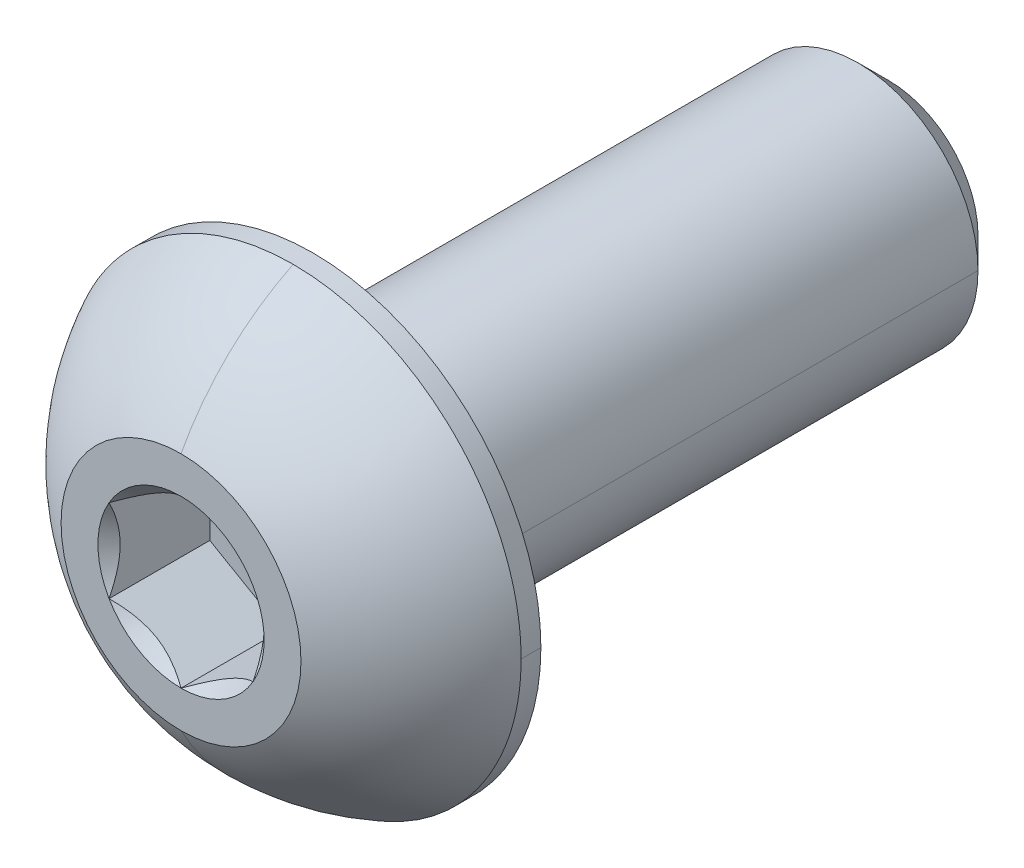
ISO-10303-21;
HEADER;
FILE_DESCRIPTION(('STEP AP214'),'2;1');
FILE_NAME('part.step','',(''),(''),'','','');
FILE_SCHEMA(('AUTOMOTIVE_DESIGN { 1 0 10303 214 1 1 1 1 }'));
ENDSEC;
DATA;
#1=APPLICATION_CONTEXT('core data for automotive mechanical design processes');
#2=APPLICATION_PROTOCOL_DEFINITION('international standard','automotive_design',2000,#1);
#3=PRODUCT_CONTEXT('',#1,'mechanical');
#4=PRODUCT('Part','Part','',(#3));
#5=PRODUCT_RELATED_PRODUCT_CATEGORY('part','',(#4));
#6=PRODUCT_DEFINITION_FORMATION('','',#4);
#7=PRODUCT_DEFINITION_CONTEXT('part definition',#1,'design');
#8=PRODUCT_DEFINITION('design','',#6,#7);
#9=PRODUCT_DEFINITION_SHAPE('','',#8);
#10=(LENGTH_UNIT() NAMED_UNIT(*) SI_UNIT(.MILLI.,.METRE.));
#11=(NAMED_UNIT(*) PLANE_ANGLE_UNIT() SI_UNIT($,.RADIAN.));
#12=(NAMED_UNIT(*) SI_UNIT($,.STERADIAN.) SOLID_ANGLE_UNIT());
#13=UNCERTAINTY_MEASURE_WITH_UNIT(LENGTH_MEASURE(1.E-05),#10,'distance_accuracy_value','');
#14=(GEOMETRIC_REPRESENTATION_CONTEXT(3) GLOBAL_UNCERTAINTY_ASSIGNED_CONTEXT((#13)) GLOBAL_UNIT_ASSIGNED_CONTEXT((#10,
#11,#12)) REPRESENTATION_CONTEXT('',''));
#15=CARTESIAN_POINT('',(0.,0.,0.));
#16=DIRECTION('',(0.,0.,1.));
#17=DIRECTION('',(1.,0.,0.));
#18=AXIS2_PLACEMENT_3D('',#15,#16,#17);
#19=CARTESIAN_POINT('',(1.5,0.866025403784439,5.275));
#20=DIRECTION('',(0.5,0.866025403784439,0.));
#21=DIRECTION('',(0.,0.,-1.));
#22=AXIS2_PLACEMENT_3D('',#19,#20,#21);
#23=PLANE('',#22);
#24=DIRECTION('',(0.,0.,1.));
#25=VECTOR('',#24,1.);
#26=CARTESIAN_POINT('',(1.5,0.866025403784439,5.275));
#27=LINE('',#26,#25);
#28=CARTESIAN_POINT('',(1.5,0.866025403784439,5.275));
#29=VERTEX_POINT('',#28);
#30=CARTESIAN_POINT('',(1.5,0.866025403784439,7.375));
#31=VERTEX_POINT('',#30);
#32=EDGE_CURVE('E10',#29,#31,#27,.T.);
#33=ORIENTED_EDGE('',*,*,#32,.T.);
#34=CARTESIAN_POINT('',(1.5,0.866025403784439,7.375));
#35=CARTESIAN_POINT('',(1.09983313244909,1.09706185248573,7.14396355129872));
#36=CARTESIAN_POINT('',(0.752762837135629,1.29744298091268,7.14295258499126));
#37=CARTESIAN_POINT('',(0.40367911573946,1.49898656143047,7.14193575386057));
#38=CARTESIAN_POINT('',(0.,1.73205080756888,7.375));
#39=B_SPLINE_CURVE_WITH_KNOTS('',2,(#34,#35,#36,#37,#38),.UNSPECIFIED.,.F.,.F.,(3,2,3),(0.,0.5,
1.),.UNSPECIFIED.);
#40=CARTESIAN_POINT('',(0.,1.73205080756888,7.375));
#41=VERTEX_POINT('',#40);
#42=EDGE_CURVE('E234',#31,#41,#39,.T.);
#43=ORIENTED_EDGE('',*,*,#42,.T.);
#44=DIRECTION('',(0.,0.,1.));
#45=VECTOR('',#44,1.);
#46=CARTESIAN_POINT('',(0.,1.73205080756888,5.275));
#47=LINE('',#46,#45);
#48=CARTESIAN_POINT('',(0.,1.73205080756888,5.275));
#49=VERTEX_POINT('',#48);
#50=EDGE_CURVE('E248',#49,#41,#47,.T.);
#51=ORIENTED_EDGE('',*,*,#50,.F.);
#52=DIRECTION('',(-0.866025403784439,0.5,0.));
#53=VECTOR('',#52,1.);
#54=CARTESIAN_POINT('',(1.5,0.866025403784439,5.275));
#55=LINE('',#54,#53);
#56=EDGE_CURVE('E229',#29,#49,#55,.T.);
#57=ORIENTED_EDGE('',*,*,#56,.F.);
#58=EDGE_LOOP('',(#33,#43,#51,#57));
#59=FACE_BOUND('',#58,.T.);
#60=ADVANCED_FACE('F16',(#59),#23,.F.);
#61=CARTESIAN_POINT('',(1.5,-0.866025403784439,5.275));
#62=DIRECTION('',(1.,0.,0.));
#63=DIRECTION('',(0.,-1.,0.));
#64=AXIS2_PLACEMENT_3D('',#61,#62,#63);
#65=PLANE('',#64);
#66=DIRECTION('',(0.,0.,1.));
#67=VECTOR('',#66,1.);
#68=CARTESIAN_POINT('',(1.5,-0.866025403784439,5.275));
#69=LINE('',#68,#67);
#70=CARTESIAN_POINT('',(1.5,-0.866025403784439,5.275));
#71=VERTEX_POINT('',#70);
#72=CARTESIAN_POINT('',(1.5,-0.866025403784439,7.375));
#73=VERTEX_POINT('',#72);
#74=EDGE_CURVE('E28',#71,#73,#69,.T.);
#75=ORIENTED_EDGE('',*,*,#74,.T.);
#76=CARTESIAN_POINT('',(1.5,-0.86602540378444,7.375));
#77=CARTESIAN_POINT('',(1.5,-0.646658602548743,7.26531659938215));
#78=CARTESIAN_POINT('',(1.5,-0.445863993413875,7.20781171055307));
#79=CARTESIAN_POINT('',(1.5,-0.219378137358921,7.14294919243113));
#80=CARTESIAN_POINT('',(1.5,0.,7.14294919243113));
#81=B_SPLINE_CURVE_WITH_KNOTS('',2,(#76,#77,#78,#79,#80),.UNSPECIFIED.,.F.,.F.,(3,2,3),(0.,0.5,
1.),.UNSPECIFIED.);
#82=CARTESIAN_POINT('',(1.5,0.,7.14294919243112));
#83=VERTEX_POINT('',#82);
#84=EDGE_CURVE('E514',#73,#83,#81,.T.);
#85=ORIENTED_EDGE('',*,*,#84,.T.);
#86=CARTESIAN_POINT('',(1.5,0.,7.14294919243113));
#87=CARTESIAN_POINT('',(1.5,0.217075978680463,7.14294919243113));
#88=CARTESIAN_POINT('',(1.5,0.445959967478607,7.20783905839392));
#89=CARTESIAN_POINT('',(1.5,0.643987045881881,7.26398082104872));
#90=CARTESIAN_POINT('',(1.5,0.866025403784441,7.375));
#91=B_SPLINE_CURVE_WITH_KNOTS('',2,(#86,#87,#88,#89,#90),.UNSPECIFIED.,.F.,.F.,(3,2,3),(0.,0.5,
1.),.UNSPECIFIED.);
#92=EDGE_CURVE('E404',#83,#31,#91,.T.);
#93=ORIENTED_EDGE('',*,*,#92,.T.);
#94=ORIENTED_EDGE('',*,*,#32,.F.);
#95=DIRECTION('',(0.,1.,0.));
#96=VECTOR('',#95,1.);
#97=CARTESIAN_POINT('',(1.5,-0.866025403784439,5.275));
#98=LINE('',#97,#96);
#99=EDGE_CURVE('E214',#71,#29,#98,.T.);
#100=ORIENTED_EDGE('',*,*,#99,.F.);
#101=EDGE_LOOP('',(#75,#85,#93,#94,#100));
#102=FACE_BOUND('',#101,.T.);
#103=ADVANCED_FACE('F383',(#102),#65,.F.);
#104=CARTESIAN_POINT('',(0.,-1.73205080756887,5.275));
#105=DIRECTION('',(0.5,-0.866025403784439,0.));
#106=DIRECTION('',(0.,0.,-1.));
#107=AXIS2_PLACEMENT_3D('',#104,#105,#106);
#108=PLANE('',#107);
#109=DIRECTION('',(0.,0.,1.));
#110=VECTOR('',#109,1.);
#111=CARTESIAN_POINT('',(0.,-1.73205080756887,5.275));
#112=LINE('',#111,#110);
#113=CARTESIAN_POINT('',(0.,-1.73205080756887,5.275));
#114=VERTEX_POINT('',#113);
#115=CARTESIAN_POINT('',(0.,-1.73205080756888,7.375));
#116=VERTEX_POINT('',#115);
#117=EDGE_CURVE('E52',#114,#116,#112,.T.);
#118=ORIENTED_EDGE('',*,*,#117,.T.);
#119=CARTESIAN_POINT('',(0.,-1.73205080756887,7.375));
#120=CARTESIAN_POINT('',(0.400166867549829,-1.50101435886821,7.14396355129934));
#121=CARTESIAN_POINT('',(0.74723716286437,-1.30063323044064,7.14295258499126));
#122=CARTESIAN_POINT('',(1.09632088425947,-1.09908964992346,7.14193575385996));
#123=CARTESIAN_POINT('',(1.5,-0.866025403784437,7.375));
#124=B_SPLINE_CURVE_WITH_KNOTS('',2,(#119,#120,#121,#122,#123),.UNSPECIFIED.,.F.,.F.,(3,2,3),
(0.,0.5,1.),.UNSPECIFIED.);
#125=EDGE_CURVE('E428',#116,#73,#124,.T.);
#126=ORIENTED_EDGE('',*,*,#125,.T.);
#127=ORIENTED_EDGE('',*,*,#74,.F.);
#128=DIRECTION('',(0.866025403784439,0.5,0.));
#129=VECTOR('',#128,1.);
#130=CARTESIAN_POINT('',(0.,-1.73205080756887,5.275));
#131=LINE('',#130,#129);
#132=EDGE_CURVE('E210',#114,#71,#131,.T.);
#133=ORIENTED_EDGE('',*,*,#132,.F.);
#134=EDGE_LOOP('',(#118,#126,#127,#133));
#135=FACE_BOUND('',#134,.T.);
#136=ADVANCED_FACE('F382',(#135),#108,.F.);
#137=CARTESIAN_POINT('',(-1.5,-0.866025403784438,5.275));
#138=DIRECTION('',(-0.5,-0.866025403784439,0.));
#139=DIRECTION('',(-0.866025403784439,0.5,0.));
#140=AXIS2_PLACEMENT_3D('',#137,#138,#139);
#141=PLANE('',#140);
#142=DIRECTION('',(0.,0.,1.));
#143=VECTOR('',#142,1.);
#144=CARTESIAN_POINT('',(-1.5,-0.866025403784438,5.275));
#145=LINE('',#144,#143);
#146=CARTESIAN_POINT('',(-1.5,-0.866025403784438,5.275));
#147=VERTEX_POINT('',#146);
#148=CARTESIAN_POINT('',(-1.5,-0.866025403784439,7.375));
#149=VERTEX_POINT('',#148);
#150=EDGE_CURVE('E358',#147,#149,#145,.T.);
#151=ORIENTED_EDGE('',*,*,#150,.T.);
#152=CARTESIAN_POINT('',(-1.5,-0.866025403784438,7.375));
#153=CARTESIAN_POINT('',(-1.09983313244963,-1.09706185248541,7.14396355129903));
#154=CARTESIAN_POINT('',(-0.752762837135629,-1.29744298091268,7.14295258499127));
#155=CARTESIAN_POINT('',(-0.403679115739988,-1.49898656143016,7.14193575386027));
#156=CARTESIAN_POINT('',(0.,-1.73205080756888,7.375));
#157=B_SPLINE_CURVE_WITH_KNOTS('',2,(#152,#153,#154,#155,#156),.UNSPECIFIED.,.F.,.F.,(3,2,3),
(0.,0.5,1.),.UNSPECIFIED.);
#158=EDGE_CURVE('E369',#149,#116,#157,.T.);
#159=ORIENTED_EDGE('',*,*,#158,.T.);
#160=ORIENTED_EDGE('',*,*,#117,.F.);
#161=DIRECTION('',(0.866025403784439,-0.5,0.));
#162=VECTOR('',#161,1.);
#163=CARTESIAN_POINT('',(-1.5,-0.866025403784438,5.275));
#164=LINE('',#163,#162);
#165=EDGE_CURVE('E215',#147,#114,#164,.T.);
#166=ORIENTED_EDGE('',*,*,#165,.F.);
#167=EDGE_LOOP('',(#151,#159,#160,#166));
#168=FACE_BOUND('',#167,.T.);
#169=ADVANCED_FACE('F374',(#168),#141,.F.);
#170=CARTESIAN_POINT('',(-1.5,0.866025403784439,5.275));
#171=DIRECTION('',(-1.,0.,0.));
#172=DIRECTION('',(0.,0.,1.));
#173=AXIS2_PLACEMENT_3D('',#170,#171,#172);
#174=PLANE('',#173);
#175=DIRECTION('',(0.,0.,1.));
#176=VECTOR('',#175,1.);
#177=CARTESIAN_POINT('',(-1.5,0.866025403784439,5.275));
#178=LINE('',#177,#176);
#179=CARTESIAN_POINT('',(-1.5,0.866025403784439,5.275));
#180=VERTEX_POINT('',#179);
#181=CARTESIAN_POINT('',(-1.5,0.866025403784439,7.375));
#182=VERTEX_POINT('',#181);
#183=EDGE_CURVE('E464',#180,#182,#178,.T.);
#184=ORIENTED_EDGE('',*,*,#183,.T.);
#185=CARTESIAN_POINT('',(-1.5,0.866025403784439,7.375));
#186=CARTESIAN_POINT('',(-1.5,0.645653699097724,7.26481414765665));
#187=CARTESIAN_POINT('',(-1.5,0.446004889099508,7.20785186068247));
#188=CARTESIAN_POINT('',(-1.5,0.218857205999636,7.14304380342248));
#189=CARTESIAN_POINT('',(-1.5,9.44212914020083E-05,7.14294919540292));
#190=CARTESIAN_POINT('',(-1.5,-0.217614156110431,7.14285504329484));
#191=CARTESIAN_POINT('',(-1.5,-0.445819185272561,7.20779894431054));
#192=CARTESIAN_POINT('',(-1.5,-0.644979895373496,7.26447724579453));
#193=CARTESIAN_POINT('',(-1.5,-0.866025403784441,7.375));
#194=B_SPLINE_CURVE_WITH_KNOTS('',2,(#185,#186,#187,#188,#189,#190,#191,#192,#193),
.UNSPECIFIED.,.F.,.F.,(3,2,2,2,3),(0.,0.25,0.5,0.75,1.),.UNSPECIFIED.);
#195=EDGE_CURVE('E477',#182,#149,#194,.T.);
#196=ORIENTED_EDGE('',*,*,#195,.T.);
#197=ORIENTED_EDGE('',*,*,#150,.F.);
#198=DIRECTION('',(0.,-1.,0.));
#199=VECTOR('',#198,1.);
#200=CARTESIAN_POINT('',(-1.5,0.866025403784439,5.275));
#201=LINE('',#200,#199);
#202=EDGE_CURVE('E238',#180,#147,#201,.T.);
#203=ORIENTED_EDGE('',*,*,#202,.F.);
#204=EDGE_LOOP('',(#184,#196,#197,#203));
#205=FACE_BOUND('',#204,.T.);
#206=ADVANCED_FACE('F291',(#205),#174,.F.);
#207=CARTESIAN_POINT('',(0.,1.73205080756888,5.275));
#208=DIRECTION('',(-0.5,0.866025403784439,0.));
#209=DIRECTION('',(0.,0.,1.));
#210=AXIS2_PLACEMENT_3D('',#207,#208,#209);
#211=PLANE('',#210);
#212=ORIENTED_EDGE('',*,*,#50,.T.);
#213=CARTESIAN_POINT('',(0.,1.73205080756888,7.375));
#214=CARTESIAN_POINT('',(-0.400166867550372,1.5010143588679,7.14396355129903));
#215=CARTESIAN_POINT('',(-0.747237162864371,1.30063323044064,7.14295258499126));
#216=CARTESIAN_POINT('',(-1.09632088426,1.09908964992316,7.14193575386027));
#217=CARTESIAN_POINT('',(-1.5,0.866025403784442,7.375));
#218=B_SPLINE_CURVE_WITH_KNOTS('',2,(#213,#214,#215,#216,#217),.UNSPECIFIED.,.F.,.F.,(3,2,3),
(0.,0.5,1.),.UNSPECIFIED.);
#219=EDGE_CURVE('E228',#41,#182,#218,.T.);
#220=ORIENTED_EDGE('',*,*,#219,.T.);
#221=ORIENTED_EDGE('',*,*,#183,.F.);
#222=DIRECTION('',(-0.866025403784439,-0.5,0.));
#223=VECTOR('',#222,1.);
#224=CARTESIAN_POINT('',(0.,1.73205080756888,5.275));
#225=LINE('',#224,#223);
#226=EDGE_CURVE('E233',#49,#180,#225,.T.);
#227=ORIENTED_EDGE('',*,*,#226,.F.);
#228=EDGE_LOOP('',(#212,#220,#221,#227));
#229=FACE_BOUND('',#228,.T.);
#230=ADVANCED_FACE('F286',(#229),#211,.F.);
#231=CARTESIAN_POINT('',(0.,0.,5.275));
#232=DIRECTION('',(0.,0.,1.));
#233=DIRECTION('',(1.,0.,0.));
#234=AXIS2_PLACEMENT_3D('',#231,#232,#233);
#235=PLANE('',#234);
#236=ORIENTED_EDGE('',*,*,#56,.T.);
#237=ORIENTED_EDGE('',*,*,#226,.T.);
#238=ORIENTED_EDGE('',*,*,#202,.T.);
#239=ORIENTED_EDGE('',*,*,#165,.T.);
#240=ORIENTED_EDGE('',*,*,#132,.T.);
#241=ORIENTED_EDGE('',*,*,#99,.T.);
#242=EDGE_LOOP('',(#236,#237,#238,#239,#240,#241));
#243=FACE_BOUND('',#242,.T.);
#244=ADVANCED_FACE('F281',(#243),#235,.T.);
#245=CARTESIAN_POINT('',(0.,0.,7.375));
#246=DIRECTION('',(0.,0.,1.));
#247=DIRECTION('',(1.,0.,0.));
#248=AXIS2_PLACEMENT_3D('',#245,#246,#247);
#249=CONICAL_SURFACE('',#248,1.73205080756888,0.78539816339745);
#250=CARTESIAN_POINT('',(0.,0.,7.375));
#251=DIRECTION('',(0.,0.,1.));
#252=DIRECTION('',(1.,0.,0.));
#253=AXIS2_PLACEMENT_3D('',#250,#251,#252);
#254=CIRCLE('',#253,1.73205080756888);
#255=EDGE_CURVE('E534',#31,#41,#254,.T.);
#256=ORIENTED_EDGE('',*,*,#255,.T.);
#257=ORIENTED_EDGE('',*,*,#42,.F.);
#258=EDGE_LOOP('',(#256,#257));
#259=FACE_BOUND('',#258,.T.);
#260=ADVANCED_FACE('F270',(#259),#249,.F.);
#261=CARTESIAN_POINT('',(0.,0.,7.375));
#262=DIRECTION('',(0.,0.,1.));
#263=DIRECTION('',(1.,0.,0.));
#264=AXIS2_PLACEMENT_3D('',#261,#262,#263);
#265=CONICAL_SURFACE('',#264,1.73205080756888,0.78539816339745);
#266=DIRECTION('',(0.707106781186549,0.,0.707106781186546));
#267=VECTOR('',#266,1.);
#268=CARTESIAN_POINT('',(1.73205080756888,0.,7.375));
#269=LINE('',#268,#267);
#270=CARTESIAN_POINT('',(1.73205080756888,0.,7.375));
#271=VERTEX_POINT('',#270);
#272=EDGE_CURVE('E407',#83,#271,#269,.T.);
#273=ORIENTED_EDGE('',*,*,#272,.F.);
#274=ORIENTED_EDGE('',*,*,#84,.F.);
#275=CARTESIAN_POINT('',(0.,0.,7.375));
#276=DIRECTION('',(0.,0.,1.));
#277=DIRECTION('',(1.,0.,0.));
#278=AXIS2_PLACEMENT_3D('',#275,#276,#277);
#279=CIRCLE('',#278,1.73205080756888);
#280=EDGE_CURVE('E538',#73,#271,#279,.T.);
#281=ORIENTED_EDGE('',*,*,#280,.T.);
#282=EDGE_LOOP('',(#273,#274,#281));
#283=FACE_BOUND('',#282,.T.);
#284=ADVANCED_FACE('F280',(#283),#265,.F.);
#285=CARTESIAN_POINT('',(0.,0.,7.375));
#286=DIRECTION('',(0.,0.,1.));
#287=DIRECTION('',(1.,0.,0.));
#288=AXIS2_PLACEMENT_3D('',#285,#286,#287);
#289=CONICAL_SURFACE('',#288,1.73205080756888,0.78539816339745);
#290=CARTESIAN_POINT('',(0.,0.,7.375));
#291=DIRECTION('',(0.,0.,1.));
#292=DIRECTION('',(1.,0.,0.));
#293=AXIS2_PLACEMENT_3D('',#290,#291,#292);
#294=CIRCLE('',#293,1.73205080756888);
#295=EDGE_CURVE('E364',#116,#73,#294,.T.);
#296=ORIENTED_EDGE('',*,*,#295,.T.);
#297=ORIENTED_EDGE('',*,*,#125,.F.);
#298=EDGE_LOOP('',(#296,#297));
#299=FACE_BOUND('',#298,.T.);
#300=ADVANCED_FACE('F336',(#299),#289,.F.);
#301=CARTESIAN_POINT('',(0.,0.,7.375));
#302=DIRECTION('',(0.,0.,1.));
#303=DIRECTION('',(1.,0.,0.));
#304=AXIS2_PLACEMENT_3D('',#301,#302,#303);
#305=CONICAL_SURFACE('',#304,1.73205080756888,0.78539816339745);
#306=CARTESIAN_POINT('',(0.,0.,7.375));
#307=DIRECTION('',(0.,0.,1.));
#308=DIRECTION('',(1.,0.,0.));
#309=AXIS2_PLACEMENT_3D('',#306,#307,#308);
#310=CIRCLE('',#309,1.73205080756888);
#311=EDGE_CURVE('E220',#149,#116,#310,.T.);
#312=ORIENTED_EDGE('',*,*,#311,.T.);
#313=ORIENTED_EDGE('',*,*,#158,.F.);
#314=EDGE_LOOP('',(#312,#313));
#315=FACE_BOUND('',#314,.T.);
#316=ADVANCED_FACE('F340',(#315),#305,.F.);
#317=CARTESIAN_POINT('',(0.,0.,7.375));
#318=DIRECTION('',(0.,0.,1.));
#319=DIRECTION('',(1.,0.,0.));
#320=AXIS2_PLACEMENT_3D('',#317,#318,#319);
#321=CONICAL_SURFACE('',#320,1.73205080756888,0.78539816339745);
#322=CARTESIAN_POINT('',(0.,0.,7.375));
#323=DIRECTION('',(0.,0.,1.));
#324=DIRECTION('',(1.,0.,0.));
#325=AXIS2_PLACEMENT_3D('',#322,#323,#324);
#326=CIRCLE('',#325,1.73205080756888);
#327=EDGE_CURVE('E218',#182,#149,#326,.T.);
#328=ORIENTED_EDGE('',*,*,#327,.T.);
#329=ORIENTED_EDGE('',*,*,#195,.F.);
#330=EDGE_LOOP('',(#328,#329));
#331=FACE_BOUND('',#330,.T.);
#332=ADVANCED_FACE('F327',(#331),#321,.F.);
#333=CARTESIAN_POINT('',(0.,0.,7.375));
#334=DIRECTION('',(0.,0.,1.));
#335=DIRECTION('',(1.,0.,0.));
#336=AXIS2_PLACEMENT_3D('',#333,#334,#335);
#337=CONICAL_SURFACE('',#336,1.73205080756888,0.78539816339745);
#338=CARTESIAN_POINT('',(0.,0.,7.375));
#339=DIRECTION('',(0.,0.,1.));
#340=DIRECTION('',(1.,0.,0.));
#341=AXIS2_PLACEMENT_3D('',#338,#339,#340);
#342=CIRCLE('',#341,1.73205080756888);
#343=EDGE_CURVE('E470',#41,#182,#342,.T.);
#344=ORIENTED_EDGE('',*,*,#343,.T.);
#345=ORIENTED_EDGE('',*,*,#219,.F.);
#346=EDGE_LOOP('',(#344,#345));
#347=FACE_BOUND('',#346,.T.);
#348=ADVANCED_FACE('F316',(#347),#337,.F.);
#349=CARTESIAN_POINT('',(0.,0.,-7.375));
#350=DIRECTION('',(0.,0.,1.));
#351=DIRECTION('',(1.,0.,0.));
#352=AXIS2_PLACEMENT_3D('',#349,#350,#351);
#353=PLANE('',#352);
#354=CARTESIAN_POINT('',(0.,0.,-7.375));
#355=DIRECTION('',(0.,0.,1.));
#356=DIRECTION('',(1.,0.,0.));
#357=AXIS2_PLACEMENT_3D('',#354,#355,#356);
#358=CIRCLE('',#357,1.86);
#359=CARTESIAN_POINT('',(1.86,0.,-7.375));
#360=VERTEX_POINT('',#359);
#361=CARTESIAN_POINT('',(-1.86,0.,-7.375));
#362=VERTEX_POINT('',#361);
#363=EDGE_CURVE('E420',#360,#362,#358,.T.);
#364=ORIENTED_EDGE('',*,*,#363,.F.);
#365=CARTESIAN_POINT('',(0.,0.,-7.375));
#366=DIRECTION('',(0.,0.,1.));
#367=DIRECTION('',(1.,0.,0.));
#368=AXIS2_PLACEMENT_3D('',#365,#366,#367);
#369=CIRCLE('',#368,1.86);
#370=EDGE_CURVE('E225',#362,#360,#369,.T.);
#371=ORIENTED_EDGE('',*,*,#370,.F.);
#372=EDGE_LOOP('',(#364,#371));
#373=FACE_BOUND('',#372,.T.);
#374=ADVANCED_FACE('F326',(#373),#353,.F.);
#375=CARTESIAN_POINT('',(0.,0.,-7.375));
#376=DIRECTION('',(0.,0.,1.));
#377=DIRECTION('',(1.,0.,0.));
#378=AXIS2_PLACEMENT_3D('',#375,#376,#377);
#379=CONICAL_SURFACE('',#378,1.86,0.785398163397442);
#380=DIRECTION('',(-0.707106781186543,0.,0.707106781186552));
#381=VECTOR('',#380,1.);
#382=CARTESIAN_POINT('',(-1.86,0.,-7.375));
#383=LINE('',#382,#381);
#384=CARTESIAN_POINT('',(-2.5,0.,-6.735));
#385=VERTEX_POINT('',#384);
#386=EDGE_CURVE('E998',#362,#385,#383,.T.);
#387=ORIENTED_EDGE('',*,*,#386,.F.);
#388=ORIENTED_EDGE('',*,*,#370,.T.);
#389=DIRECTION('',(0.707106781186543,0.,0.707106781186552));
#390=VECTOR('',#389,1.);
#391=CARTESIAN_POINT('',(1.86,0.,-7.375));
#392=LINE('',#391,#390);
#393=CARTESIAN_POINT('',(2.5,0.,-6.735));
#394=VERTEX_POINT('',#393);
#395=EDGE_CURVE('E1009',#360,#394,#392,.T.);
#396=ORIENTED_EDGE('',*,*,#395,.T.);
#397=CARTESIAN_POINT('',(0.,0.,-6.735));
#398=DIRECTION('',(0.,0.,1.));
#399=DIRECTION('',(1.,0.,0.));
#400=AXIS2_PLACEMENT_3D('',#397,#398,#399);
#401=CIRCLE('',#400,2.5);
#402=EDGE_CURVE('E224',#385,#394,#401,.T.);
#403=ORIENTED_EDGE('',*,*,#402,.F.);
#404=EDGE_LOOP('',(#387,#388,#396,#403));
#405=FACE_BOUND('',#404,.T.);
#406=ADVANCED_FACE('F342',(#405),#379,.T.);
#407=CARTESIAN_POINT('',(0.,0.,7.375));
#408=DIRECTION('',(0.,0.,1.));
#409=DIRECTION('',(1.,0.,0.));
#410=AXIS2_PLACEMENT_3D('',#407,#408,#409);
#411=CYLINDRICAL_SURFACE('',#410,2.5);
#412=DIRECTION('',(0.,0.,1.));
#413=VECTOR('',#412,1.);
#414=CARTESIAN_POINT('',(-2.5,0.,7.375));
#415=LINE('',#414,#413);
#416=CARTESIAN_POINT('',(-2.5,0.,4.625));
#417=VERTEX_POINT('',#416);
#418=EDGE_CURVE('E1005',#385,#417,#415,.T.);
#419=ORIENTED_EDGE('',*,*,#418,.F.);
#420=ORIENTED_EDGE('',*,*,#402,.T.);
#421=DIRECTION('',(0.,0.,1.));
#422=VECTOR('',#421,1.);
#423=CARTESIAN_POINT('',(2.5,0.,7.375));
#424=LINE('',#423,#422);
#425=CARTESIAN_POINT('',(2.5,0.,4.625));
#426=VERTEX_POINT('',#425);
#427=EDGE_CURVE('E183',#394,#426,#424,.T.);
#428=ORIENTED_EDGE('',*,*,#427,.T.);
#429=CARTESIAN_POINT('',(0.,0.,4.625));
#430=DIRECTION('',(0.,0.,1.));
#431=DIRECTION('',(1.,0.,0.));
#432=AXIS2_PLACEMENT_3D('',#429,#430,#431);
#433=CIRCLE('',#432,2.5);
#434=EDGE_CURVE('E169',#417,#426,#433,.T.);
#435=ORIENTED_EDGE('',*,*,#434,.F.);
#436=EDGE_LOOP('',(#419,#420,#428,#435));
#437=FACE_BOUND('',#436,.T.);
#438=ADVANCED_FACE('F334',(#437),#411,.T.);
#439=CARTESIAN_POINT('',(0.,2.5,4.625));
#440=DIRECTION('',(0.,0.,1.));
#441=DIRECTION('',(1.,0.,0.));
#442=AXIS2_PLACEMENT_3D('',#439,#440,#441);
#443=PLANE('',#442);
#444=CARTESIAN_POINT('',(0.,0.,4.625));
#445=DIRECTION('',(0.,0.,1.));
#446=DIRECTION('',(1.,0.,0.));
#447=AXIS2_PLACEMENT_3D('',#444,#445,#446);
#448=CIRCLE('',#447,2.5);
#449=EDGE_CURVE('E193',#426,#417,#448,.T.);
#450=ORIENTED_EDGE('',*,*,#449,.T.);
#451=ORIENTED_EDGE('',*,*,#434,.T.);
#452=EDGE_LOOP('',(#450,#451));
#453=FACE_BOUND('',#452,.T.);
#454=CARTESIAN_POINT('',(0.,0.,4.625));
#455=DIRECTION('',(0.,0.,1.));
#456=DIRECTION('',(1.,0.,0.));
#457=AXIS2_PLACEMENT_3D('',#454,#455,#456);
#458=CIRCLE('',#457,4.75);
#459=CARTESIAN_POINT('',(4.75,0.,4.625));
#460=VERTEX_POINT('',#459);
#461=CARTESIAN_POINT('',(-4.75,0.,4.625));
#462=VERTEX_POINT('',#461);
#463=EDGE_CURVE('E174',#460,#462,#458,.T.);
#464=ORIENTED_EDGE('',*,*,#463,.F.);
#465=CARTESIAN_POINT('',(0.,0.,4.625));
#466=DIRECTION('',(0.,0.,1.));
#467=DIRECTION('',(1.,0.,0.));
#468=AXIS2_PLACEMENT_3D('',#465,#466,#467);
#469=CIRCLE('',#468,4.75);
#470=EDGE_CURVE('E158',#462,#460,#469,.T.);
#471=ORIENTED_EDGE('',*,*,#470,.F.);
#472=EDGE_LOOP('',(#464,#471));
#473=FACE_BOUND('',#472,.T.);
#474=ADVANCED_FACE('F181',(#453,#473),#443,.F.);
#475=CARTESIAN_POINT('',(0.,0.,7.375));
#476=DIRECTION('',(0.,0.,1.));
#477=DIRECTION('',(1.,0.,0.));
#478=AXIS2_PLACEMENT_3D('',#475,#476,#477);
#479=CYLINDRICAL_SURFACE('',#478,4.75);
#480=DIRECTION('',(0.,0.,1.));
#481=VECTOR('',#480,1.);
#482=CARTESIAN_POINT('',(-4.75,0.,7.375));
#483=LINE('',#482,#481);
#484=CARTESIAN_POINT('',(-4.75,0.,5.0375));
#485=VERTEX_POINT('',#484);
#486=EDGE_CURVE('E164',#462,#485,#483,.T.);
#487=ORIENTED_EDGE('',*,*,#486,.F.);
#488=ORIENTED_EDGE('',*,*,#470,.T.);
#489=DIRECTION('',(0.,0.,1.));
#490=VECTOR('',#489,1.);
#491=CARTESIAN_POINT('',(4.75,0.,7.375));
#492=LINE('',#491,#490);
#493=CARTESIAN_POINT('',(4.75,0.,5.0375));
#494=VERTEX_POINT('',#493);
#495=EDGE_CURVE('E161',#460,#494,#492,.T.);
#496=ORIENTED_EDGE('',*,*,#495,.T.);
#497=CARTESIAN_POINT('',(0.,0.,5.0375));
#498=DIRECTION('',(0.,0.,1.));
#499=DIRECTION('',(1.,0.,0.));
#500=AXIS2_PLACEMENT_3D('',#497,#498,#499);
#501=CIRCLE('',#500,4.75);
#502=CARTESIAN_POINT('',(0.,-4.75,5.0375));
#503=VERTEX_POINT('',#502);
#504=EDGE_CURVE('E170',#503,#494,#501,.T.);
#505=ORIENTED_EDGE('',*,*,#504,.F.);
#506=CARTESIAN_POINT('',(0.,0.,5.0375));
#507=DIRECTION('',(0.,0.,1.));
#508=DIRECTION('',(1.,0.,0.));
#509=AXIS2_PLACEMENT_3D('',#506,#507,#508);
#510=CIRCLE('',#509,4.75);
#511=EDGE_CURVE('E179',#485,#503,#510,.T.);
#512=ORIENTED_EDGE('',*,*,#511,.F.);
#513=EDGE_LOOP('',(#487,#488,#496,#505,#512));
#514=FACE_BOUND('',#513,.T.);
#515=ADVANCED_FACE('F160',(#514),#479,.T.);
#516=CARTESIAN_POINT('',(0.,0.,2.71694518716577));
#517=DIRECTION('',(-1.,0.,0.));
#518=DIRECTION('',(0.,1.,0.));
#519=AXIS2_PLACEMENT_3D('',#516,#517,#518);
#520=SPHERICAL_SURFACE('',#519,5.28653711226622);
#521=CARTESIAN_POINT('',(0.,0.,2.71694518716577));
#522=DIRECTION('',(-1.,0.,0.));
#523=DIRECTION('',(0.,-1.,0.));
#524=AXIS2_PLACEMENT_3D('',#521,#522,#523);
#525=CIRCLE('',#524,5.28653711226622);
#526=CARTESIAN_POINT('',(0.,-2.5,7.375));
#527=VERTEX_POINT('',#526);
#528=EDGE_CURVE('E197',#503,#527,#525,.T.);
#529=ORIENTED_EDGE('',*,*,#528,.F.);
#530=ORIENTED_EDGE('',*,*,#504,.T.);
#531=CARTESIAN_POINT('',(0.,0.,5.0375));
#532=DIRECTION('',(0.,0.,1.));
#533=DIRECTION('',(1.,0.,0.));
#534=AXIS2_PLACEMENT_3D('',#531,#532,#533);
#535=CIRCLE('',#534,4.75);
#536=CARTESIAN_POINT('',(0.,4.75,5.0375));
#537=VERTEX_POINT('',#536);
#538=EDGE_CURVE('E177',#494,#537,#535,.T.);
#539=ORIENTED_EDGE('',*,*,#538,.T.);
#540=CARTESIAN_POINT('',(0.,0.,2.71694518716577));
#541=DIRECTION('',(1.,0.,0.));
#542=DIRECTION('',(0.,0.,-1.));
#543=AXIS2_PLACEMENT_3D('',#540,#541,#542);
#544=CIRCLE('',#543,5.28653711226622);
#545=CARTESIAN_POINT('',(0.,2.5,7.375));
#546=VERTEX_POINT('',#545);
#547=EDGE_CURVE('E205',#537,#546,#544,.T.);
#548=ORIENTED_EDGE('',*,*,#547,.T.);
#549=CARTESIAN_POINT('',(0.,0.,7.375));
#550=DIRECTION('',(0.,0.,1.));
#551=DIRECTION('',(1.,0.,0.));
#552=AXIS2_PLACEMENT_3D('',#549,#550,#551);
#553=CIRCLE('',#552,2.5);
#554=EDGE_CURVE('E209',#527,#546,#553,.T.);
#555=ORIENTED_EDGE('',*,*,#554,.F.);
#556=EDGE_LOOP('',(#529,#530,#539,#548,#555));
#557=FACE_BOUND('',#556,.T.);
#558=ADVANCED_FACE('F328',(#557),#520,.T.);
#559=CARTESIAN_POINT('',(0.,0.,7.375));
#560=DIRECTION('',(0.,0.,-1.));
#561=DIRECTION('',(0.,-1.,0.));
#562=AXIS2_PLACEMENT_3D('',#559,#560,#561);
#563=PLANE('',#562);
#564=ORIENTED_EDGE('',*,*,#327,.F.);
#565=ORIENTED_EDGE('',*,*,#343,.F.);
#566=ORIENTED_EDGE('',*,*,#255,.F.);
#567=CARTESIAN_POINT('',(0.,0.,7.375));
#568=DIRECTION('',(0.,0.,1.));
#569=DIRECTION('',(1.,0.,0.));
#570=AXIS2_PLACEMENT_3D('',#567,#568,#569);
#571=CIRCLE('',#570,1.73205080756888);
#572=EDGE_CURVE('E409',#271,#31,#571,.T.);
#573=ORIENTED_EDGE('',*,*,#572,.F.);
#574=ORIENTED_EDGE('',*,*,#280,.F.);
#575=ORIENTED_EDGE('',*,*,#295,.F.);
#576=ORIENTED_EDGE('',*,*,#311,.F.);
#577=EDGE_LOOP('',(#564,#565,#566,#573,#574,#575,#576));
#578=FACE_BOUND('',#577,.T.);
#579=CARTESIAN_POINT('',(0.,0.,7.375));
#580=DIRECTION('',(0.,0.,1.));
#581=DIRECTION('',(1.,0.,0.));
#582=AXIS2_PLACEMENT_3D('',#579,#580,#581);
#583=CIRCLE('',#582,2.5);
#584=EDGE_CURVE('E201',#546,#527,#583,.T.);
#585=ORIENTED_EDGE('',*,*,#584,.T.);
#586=ORIENTED_EDGE('',*,*,#554,.T.);
#587=EDGE_LOOP('',(#585,#586));
#588=FACE_BOUND('',#587,.T.);
#589=ADVANCED_FACE('F536',(#578,#588),#563,.F.);
#590=CARTESIAN_POINT('',(0.,0.,2.71694518716577));
#591=DIRECTION('',(-1.,0.,0.));
#592=DIRECTION('',(0.,1.,0.));
#593=AXIS2_PLACEMENT_3D('',#590,#591,#592);
#594=SPHERICAL_SURFACE('',#593,5.28653711226622);
#595=CARTESIAN_POINT('',(0.,0.,5.0375));
#596=DIRECTION('',(0.,0.,1.));
#597=DIRECTION('',(1.,0.,0.));
#598=AXIS2_PLACEMENT_3D('',#595,#596,#597);
#599=CIRCLE('',#598,4.75);
#600=EDGE_CURVE('E189',#537,#485,#599,.T.);
#601=ORIENTED_EDGE('',*,*,#600,.T.);
#602=ORIENTED_EDGE('',*,*,#511,.T.);
#603=ORIENTED_EDGE('',*,*,#528,.T.);
#604=ORIENTED_EDGE('',*,*,#584,.F.);
#605=ORIENTED_EDGE('',*,*,#547,.F.);
#606=EDGE_LOOP('',(#601,#602,#603,#604,#605));
#607=FACE_BOUND('',#606,.T.);
#608=ADVANCED_FACE('F644',(#607),#594,.T.);
#609=CARTESIAN_POINT('',(0.,0.,7.375));
#610=DIRECTION('',(0.,0.,1.));
#611=DIRECTION('',(1.,0.,0.));
#612=AXIS2_PLACEMENT_3D('',#609,#610,#611);
#613=CYLINDRICAL_SURFACE('',#612,4.75);
#614=ORIENTED_EDGE('',*,*,#463,.T.);
#615=ORIENTED_EDGE('',*,*,#486,.T.);
#616=ORIENTED_EDGE('',*,*,#600,.F.);
#617=ORIENTED_EDGE('',*,*,#538,.F.);
#618=ORIENTED_EDGE('',*,*,#495,.F.);
#619=EDGE_LOOP('',(#614,#615,#616,#617,#618));
#620=FACE_BOUND('',#619,.T.);
#621=ADVANCED_FACE('F173',(#620),#613,.T.);
#622=CARTESIAN_POINT('',(0.,0.,7.375));
#623=DIRECTION('',(0.,0.,1.));
#624=DIRECTION('',(1.,0.,0.));
#625=AXIS2_PLACEMENT_3D('',#622,#623,#624);
#626=CYLINDRICAL_SURFACE('',#625,2.5);
#627=CARTESIAN_POINT('',(0.,0.,-6.735));
#628=DIRECTION('',(0.,0.,1.));
#629=DIRECTION('',(1.,0.,0.));
#630=AXIS2_PLACEMENT_3D('',#627,#628,#629);
#631=CIRCLE('',#630,2.5);
#632=EDGE_CURVE('E1001',#394,#385,#631,.T.);
#633=ORIENTED_EDGE('',*,*,#632,.T.);
#634=ORIENTED_EDGE('',*,*,#418,.T.);
#635=ORIENTED_EDGE('',*,*,#449,.F.);
#636=ORIENTED_EDGE('',*,*,#427,.F.);
#637=EDGE_LOOP('',(#633,#634,#635,#636));
#638=FACE_BOUND('',#637,.T.);
#639=ADVANCED_FACE('F445',(#638),#626,.T.);
#640=CARTESIAN_POINT('',(0.,0.,-7.375));
#641=DIRECTION('',(0.,0.,1.));
#642=DIRECTION('',(1.,0.,0.));
#643=AXIS2_PLACEMENT_3D('',#640,#641,#642);
#644=CONICAL_SURFACE('',#643,1.86,0.785398163397442);
#645=ORIENTED_EDGE('',*,*,#363,.T.);
#646=ORIENTED_EDGE('',*,*,#386,.T.);
#647=ORIENTED_EDGE('',*,*,#632,.F.);
#648=ORIENTED_EDGE('',*,*,#395,.F.);
#649=EDGE_LOOP('',(#645,#646,#647,#648));
#650=FACE_BOUND('',#649,.T.);
#651=ADVANCED_FACE('F442',(#650),#644,.T.);
#652=CARTESIAN_POINT('',(0.,0.,7.375));
#653=DIRECTION('',(0.,0.,1.));
#654=DIRECTION('',(1.,0.,0.));
#655=AXIS2_PLACEMENT_3D('',#652,#653,#654);
#656=CONICAL_SURFACE('',#655,1.73205080756888,0.78539816339745);
#657=ORIENTED_EDGE('',*,*,#92,.F.);
#658=ORIENTED_EDGE('',*,*,#272,.T.);
#659=ORIENTED_EDGE('',*,*,#572,.T.);
#660=EDGE_LOOP('',(#657,#658,#659));
#661=FACE_BOUND('',#660,.T.);
#662=ADVANCED_FACE('F405',(#661),#656,.F.);
#663=CLOSED_SHELL('',(#60,#103,#136,#169,#206,#230,#244,#260,#284,#300,#316,#332,#348,#374,#406,
#438,#474,#515,#558,#589,#608,#621,#639,#651,#662));
#664=MANIFOLD_SOLID_BREP('B1',#663);
#665=ADVANCED_BREP_SHAPE_REPRESENTATION('',(#18,#664),#14);
#666=SHAPE_DEFINITION_REPRESENTATION(#9,#665);
ENDSEC;
END-ISO-10303-21;
